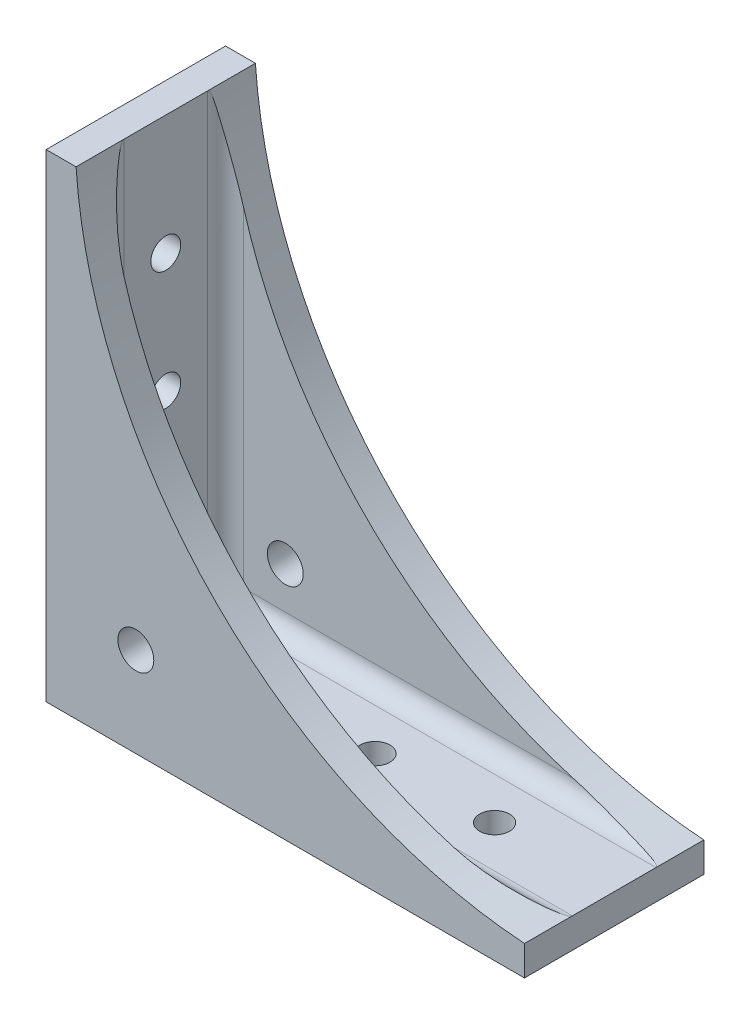
ISO-10303-21;
HEADER;
FILE_DESCRIPTION(('STEP AP214'),'2;1');
FILE_NAME('part.step','',(''),(''),'','','');
FILE_SCHEMA(('AUTOMOTIVE_DESIGN { 1 0 10303 214 1 1 1 1 }'));
ENDSEC;
DATA;
#1=APPLICATION_CONTEXT('core data for automotive mechanical design processes');
#2=APPLICATION_PROTOCOL_DEFINITION('international standard','automotive_design',2000,#1);
#3=PRODUCT_CONTEXT('',#1,'mechanical');
#4=PRODUCT('Part','Part','',(#3));
#5=PRODUCT_RELATED_PRODUCT_CATEGORY('part','',(#4));
#6=PRODUCT_DEFINITION_FORMATION('','',#4);
#7=PRODUCT_DEFINITION_CONTEXT('part definition',#1,'design');
#8=PRODUCT_DEFINITION('design','',#6,#7);
#9=PRODUCT_DEFINITION_SHAPE('','',#8);
#10=(LENGTH_UNIT() NAMED_UNIT(*) SI_UNIT(.MILLI.,.METRE.));
#11=(NAMED_UNIT(*) PLANE_ANGLE_UNIT() SI_UNIT($,.RADIAN.));
#12=(NAMED_UNIT(*) SI_UNIT($,.STERADIAN.) SOLID_ANGLE_UNIT());
#13=UNCERTAINTY_MEASURE_WITH_UNIT(LENGTH_MEASURE(1.E-05),#10,'distance_accuracy_value','');
#14=(GEOMETRIC_REPRESENTATION_CONTEXT(3) GLOBAL_UNCERTAINTY_ASSIGNED_CONTEXT((#13)) GLOBAL_UNIT_ASSIGNED_CONTEXT((#10,
#11,#12)) REPRESENTATION_CONTEXT('',''));
#15=CARTESIAN_POINT('',(0.,0.,0.));
#16=DIRECTION('',(0.,0.,1.));
#17=DIRECTION('',(1.,0.,0.));
#18=AXIS2_PLACEMENT_3D('',#15,#16,#17);
#19=CARTESIAN_POINT('',(5.00000000000001,5.,30.));
#20=DIRECTION('',(0.,-1.,0.));
#21=DIRECTION('',(0.,0.,-1.));
#22=AXIS2_PLACEMENT_3D('',#19,#20,#21);
#23=PLANE('',#22);
#24=CARTESIAN_POINT('',(60.,5.,15.));
#25=DIRECTION('',(0.,1.,0.));
#26=DIRECTION('',(0.,0.,1.));
#27=AXIS2_PLACEMENT_3D('',#24,#25,#26);
#28=CIRCLE('',#27,2.5);
#29=CARTESIAN_POINT('',(60.,5.,17.5));
#30=VERTEX_POINT('',#29);
#31=EDGE_CURVE('E347',#30,#30,#28,.T.);
#32=ORIENTED_EDGE('',*,*,#31,.F.);
#33=EDGE_LOOP('',(#32));
#34=FACE_BOUND('',#33,.T.);
#35=CARTESIAN_POINT('',(40.,5.,15.));
#36=DIRECTION('',(0.,1.,0.));
#37=DIRECTION('',(0.,0.,1.));
#38=AXIS2_PLACEMENT_3D('',#35,#36,#37);
#39=CIRCLE('',#38,2.5);
#40=CARTESIAN_POINT('',(40.,5.,17.5));
#41=VERTEX_POINT('',#40);
#42=EDGE_CURVE('E288',#41,#41,#39,.T.);
#43=ORIENTED_EDGE('',*,*,#42,.F.);
#44=EDGE_LOOP('',(#43));
#45=FACE_BOUND('',#44,.T.);
#46=DIRECTION('',(0.,0.,-1.));
#47=VECTOR('',#46,1.);
#48=CARTESIAN_POINT('',(80.,5.,30.));
#49=LINE('',#48,#47);
#50=CARTESIAN_POINT('',(80.,5.,22.));
#51=VERTEX_POINT('',#50);
#52=CARTESIAN_POINT('',(80.,5.,8.));
#53=VERTEX_POINT('',#52);
#54=EDGE_CURVE('E282',#51,#53,#49,.T.);
#55=ORIENTED_EDGE('',*,*,#54,.T.);
#56=DIRECTION('',(-1.,0.,0.));
#57=VECTOR('',#56,1.);
#58=CARTESIAN_POINT('',(5.00000000000001,5.,8.));
#59=LINE('',#58,#57);
#60=CARTESIAN_POINT('',(8.00000000000001,5.,8.));
#61=VERTEX_POINT('',#60);
#62=EDGE_CURVE('E151',#53,#61,#59,.T.);
#63=ORIENTED_EDGE('',*,*,#62,.T.);
#64=DIRECTION('',(0.,0.,-1.));
#65=VECTOR('',#64,1.);
#66=CARTESIAN_POINT('',(8.00000000000001,5.,22.));
#67=LINE('',#66,#65);
#68=CARTESIAN_POINT('',(8.00000000000001,5.,22.));
#69=VERTEX_POINT('',#68);
#70=EDGE_CURVE('E140',#61,#69,#67,.F.);
#71=ORIENTED_EDGE('',*,*,#70,.T.);
#72=DIRECTION('',(1.,0.,0.));
#73=VECTOR('',#72,1.);
#74=CARTESIAN_POINT('',(80.,5.,22.));
#75=LINE('',#74,#73);
#76=EDGE_CURVE('E297',#69,#51,#75,.T.);
#77=ORIENTED_EDGE('',*,*,#76,.T.);
#78=EDGE_LOOP('',(#55,#63,#71,#77));
#79=FACE_BOUND('',#78,.T.);
#80=ADVANCED_FACE('F34',(#34,#45,#79),#23,.F.);
#81=CARTESIAN_POINT('',(5.,80.,30.));
#82=DIRECTION('',(-1.,0.,0.));
#83=DIRECTION('',(0.,-1.,0.));
#84=AXIS2_PLACEMENT_3D('',#81,#82,#83);
#85=PLANE('',#84);
#86=CARTESIAN_POINT('',(5.,60.,15.));
#87=DIRECTION('',(1.,0.,0.));
#88=DIRECTION('',(0.,1.,0.));
#89=AXIS2_PLACEMENT_3D('',#86,#87,#88);
#90=CIRCLE('',#89,2.5);
#91=CARTESIAN_POINT('',(5.,62.5,15.));
#92=VERTEX_POINT('',#91);
#93=EDGE_CURVE('E289',#92,#92,#90,.T.);
#94=ORIENTED_EDGE('',*,*,#93,.F.);
#95=EDGE_LOOP('',(#94));
#96=FACE_BOUND('',#95,.T.);
#97=CARTESIAN_POINT('',(5.00000000000001,40.,15.));
#98=DIRECTION('',(1.,0.,0.));
#99=DIRECTION('',(0.,1.,0.));
#100=AXIS2_PLACEMENT_3D('',#97,#98,#99);
#101=CIRCLE('',#100,2.5);
#102=CARTESIAN_POINT('',(5.00000000000001,42.5,15.));
#103=VERTEX_POINT('',#102);
#104=EDGE_CURVE('E293',#103,#103,#101,.T.);
#105=ORIENTED_EDGE('',*,*,#104,.F.);
#106=EDGE_LOOP('',(#105));
#107=FACE_BOUND('',#106,.T.);
#108=DIRECTION('',(0.,-1.,0.));
#109=VECTOR('',#108,1.);
#110=CARTESIAN_POINT('',(5.00000000000001,5.,22.));
#111=LINE('',#110,#109);
#112=CARTESIAN_POINT('',(5.,80.,22.));
#113=VERTEX_POINT('',#112);
#114=CARTESIAN_POINT('',(5.00000000000001,8.00000000000001,22.));
#115=VERTEX_POINT('',#114);
#116=EDGE_CURVE('E117',#113,#115,#111,.T.);
#117=ORIENTED_EDGE('',*,*,#116,.T.);
#118=DIRECTION('',(0.,0.,-1.));
#119=VECTOR('',#118,1.);
#120=CARTESIAN_POINT('',(5.00000000000001,8.00000000000001,8.));
#121=LINE('',#120,#119);
#122=CARTESIAN_POINT('',(5.00000000000001,8.00000000000001,8.));
#123=VERTEX_POINT('',#122);
#124=EDGE_CURVE('E109',#115,#123,#121,.T.);
#125=ORIENTED_EDGE('',*,*,#124,.T.);
#126=DIRECTION('',(0.,1.,0.));
#127=VECTOR('',#126,1.);
#128=CARTESIAN_POINT('',(5.,80.,8.));
#129=LINE('',#128,#127);
#130=CARTESIAN_POINT('',(5.,80.,8.));
#131=VERTEX_POINT('',#130);
#132=EDGE_CURVE('E114',#123,#131,#129,.T.);
#133=ORIENTED_EDGE('',*,*,#132,.T.);
#134=DIRECTION('',(0.,0.,-1.));
#135=VECTOR('',#134,1.);
#136=CARTESIAN_POINT('',(5.,80.,30.));
#137=LINE('',#136,#135);
#138=EDGE_CURVE('E278',#113,#131,#137,.T.);
#139=ORIENTED_EDGE('',*,*,#138,.F.);
#140=EDGE_LOOP('',(#117,#125,#133,#139));
#141=FACE_BOUND('',#140,.T.);
#142=ADVANCED_FACE('F111',(#96,#107,#141),#85,.F.);
#143=CARTESIAN_POINT('',(80.,0.,30.));
#144=DIRECTION('',(0.,1.,0.));
#145=DIRECTION('',(-1.,0.,0.));
#146=AXIS2_PLACEMENT_3D('',#143,#144,#145);
#147=PLANE('',#146);
#148=CARTESIAN_POINT('',(40.,0.,15.));
#149=DIRECTION('',(0.,1.,0.));
#150=DIRECTION('',(-1.,0.,0.));
#151=AXIS2_PLACEMENT_3D('',#148,#149,#150);
#152=CIRCLE('',#151,2.5);
#153=CARTESIAN_POINT('',(37.5,0.,15.));
#154=VERTEX_POINT('',#153);
#155=EDGE_CURVE('E344',#154,#154,#152,.T.);
#156=ORIENTED_EDGE('',*,*,#155,.T.);
#157=EDGE_LOOP('',(#156));
#158=FACE_BOUND('',#157,.T.);
#159=CARTESIAN_POINT('',(60.,0.,15.));
#160=DIRECTION('',(0.,1.,0.));
#161=DIRECTION('',(-1.,0.,0.));
#162=AXIS2_PLACEMENT_3D('',#159,#160,#161);
#163=CIRCLE('',#162,2.5);
#164=CARTESIAN_POINT('',(57.5,0.,15.));
#165=VERTEX_POINT('',#164);
#166=EDGE_CURVE('E266',#165,#165,#163,.T.);
#167=ORIENTED_EDGE('',*,*,#166,.T.);
#168=EDGE_LOOP('',(#167));
#169=FACE_BOUND('',#168,.T.);
#170=DIRECTION('',(1.,0.,0.));
#171=VECTOR('',#170,1.);
#172=CARTESIAN_POINT('',(80.,0.,0.));
#173=LINE('',#172,#171);
#174=CARTESIAN_POINT('',(0.,0.,0.));
#175=VERTEX_POINT('',#174);
#176=CARTESIAN_POINT('',(80.,0.,0.));
#177=VERTEX_POINT('',#176);
#178=EDGE_CURVE('E262',#175,#177,#173,.T.);
#179=ORIENTED_EDGE('',*,*,#178,.T.);
#180=DIRECTION('',(0.,0.,-1.));
#181=VECTOR('',#180,1.);
#182=CARTESIAN_POINT('',(80.,0.,30.));
#183=LINE('',#182,#181);
#184=CARTESIAN_POINT('',(80.,0.,30.));
#185=VERTEX_POINT('',#184);
#186=EDGE_CURVE('E253',#185,#177,#183,.T.);
#187=ORIENTED_EDGE('',*,*,#186,.F.);
#188=DIRECTION('',(1.,0.,0.));
#189=VECTOR('',#188,1.);
#190=CARTESIAN_POINT('',(80.,0.,30.));
#191=LINE('',#190,#189);
#192=CARTESIAN_POINT('',(0.,0.,30.));
#193=VERTEX_POINT('',#192);
#194=EDGE_CURVE('E271',#193,#185,#191,.T.);
#195=ORIENTED_EDGE('',*,*,#194,.F.);
#196=DIRECTION('',(0.,0.,-1.));
#197=VECTOR('',#196,1.);
#198=CARTESIAN_POINT('',(0.,0.,30.));
#199=LINE('',#198,#197);
#200=EDGE_CURVE('E272',#193,#175,#199,.T.);
#201=ORIENTED_EDGE('',*,*,#200,.T.);
#202=EDGE_LOOP('',(#179,#187,#195,#201));
#203=FACE_BOUND('',#202,.T.);
#204=ADVANCED_FACE('F211',(#158,#169,#203),#147,.F.);
#205=CARTESIAN_POINT('',(80.,5.,30.));
#206=DIRECTION('',(-1.,0.,0.));
#207=DIRECTION('',(0.,0.,1.));
#208=AXIS2_PLACEMENT_3D('',#205,#206,#207);
#209=PLANE('',#208);
#210=DIRECTION('',(0.,1.,0.));
#211=VECTOR('',#210,1.);
#212=CARTESIAN_POINT('',(80.,5.,0.));
#213=LINE('',#212,#211);
#214=CARTESIAN_POINT('',(80.,5.,0.));
#215=VERTEX_POINT('',#214);
#216=EDGE_CURVE('E246',#177,#215,#213,.T.);
#217=ORIENTED_EDGE('',*,*,#216,.T.);
#218=DIRECTION('',(0.,0.,-1.));
#219=VECTOR('',#218,1.);
#220=CARTESIAN_POINT('',(80.,5.,5.));
#221=LINE('',#220,#219);
#222=EDGE_CURVE('E162',#53,#215,#221,.T.);
#223=ORIENTED_EDGE('',*,*,#222,.F.);
#224=ORIENTED_EDGE('',*,*,#54,.F.);
#225=CARTESIAN_POINT('',(80.,5.,30.));
#226=VERTEX_POINT('',#225);
#227=EDGE_CURVE('E72',#226,#51,#49,.T.);
#228=ORIENTED_EDGE('',*,*,#227,.F.);
#229=DIRECTION('',(0.,1.,0.));
#230=VECTOR('',#229,1.);
#231=CARTESIAN_POINT('',(80.,5.,30.));
#232=LINE('',#231,#230);
#233=EDGE_CURVE('E321',#185,#226,#232,.T.);
#234=ORIENTED_EDGE('',*,*,#233,.F.);
#235=ORIENTED_EDGE('',*,*,#186,.T.);
#236=EDGE_LOOP('',(#217,#223,#224,#228,#234,#235));
#237=FACE_BOUND('',#236,.T.);
#238=ADVANCED_FACE('F231',(#237),#209,.F.);
#239=CARTESIAN_POINT('',(0.,80.,30.));
#240=DIRECTION('',(0.,-1.,0.));
#241=DIRECTION('',(0.,0.,-1.));
#242=AXIS2_PLACEMENT_3D('',#239,#240,#241);
#243=PLANE('',#242);
#244=DIRECTION('',(-1.,0.,0.));
#245=VECTOR('',#244,1.);
#246=CARTESIAN_POINT('',(0.,80.,0.));
#247=LINE('',#246,#245);
#248=CARTESIAN_POINT('',(5.,80.,0.));
#249=VERTEX_POINT('',#248);
#250=CARTESIAN_POINT('',(0.,80.,0.));
#251=VERTEX_POINT('',#250);
#252=EDGE_CURVE('E261',#249,#251,#247,.T.);
#253=ORIENTED_EDGE('',*,*,#252,.T.);
#254=DIRECTION('',(0.,0.,-1.));
#255=VECTOR('',#254,1.);
#256=CARTESIAN_POINT('',(0.,80.,30.));
#257=LINE('',#256,#255);
#258=CARTESIAN_POINT('',(0.,80.,30.));
#259=VERTEX_POINT('',#258);
#260=EDGE_CURVE('E275',#259,#251,#257,.T.);
#261=ORIENTED_EDGE('',*,*,#260,.F.);
#262=DIRECTION('',(-1.,0.,0.));
#263=VECTOR('',#262,1.);
#264=CARTESIAN_POINT('',(0.,80.,30.));
#265=LINE('',#264,#263);
#266=CARTESIAN_POINT('',(5.,80.,30.));
#267=VERTEX_POINT('',#266);
#268=EDGE_CURVE('E324',#267,#259,#265,.T.);
#269=ORIENTED_EDGE('',*,*,#268,.F.);
#270=EDGE_CURVE('E279',#267,#113,#137,.T.);
#271=ORIENTED_EDGE('',*,*,#270,.T.);
#272=ORIENTED_EDGE('',*,*,#138,.T.);
#273=DIRECTION('',(0.,0.,-1.));
#274=VECTOR('',#273,1.);
#275=CARTESIAN_POINT('',(5.,80.,5.));
#276=LINE('',#275,#274);
#277=EDGE_CURVE('E204',#131,#249,#276,.T.);
#278=ORIENTED_EDGE('',*,*,#277,.T.);
#279=EDGE_LOOP('',(#253,#261,#269,#271,#272,#278));
#280=FACE_BOUND('',#279,.T.);
#281=ADVANCED_FACE('F233',(#280),#243,.F.);
#282=CARTESIAN_POINT('',(0.,0.,30.));
#283=DIRECTION('',(1.,0.,0.));
#284=DIRECTION('',(0.,0.,-1.));
#285=AXIS2_PLACEMENT_3D('',#282,#283,#284);
#286=PLANE('',#285);
#287=CARTESIAN_POINT('',(0.,40.,15.));
#288=DIRECTION('',(1.,0.,0.));
#289=DIRECTION('',(0.,0.,-1.));
#290=AXIS2_PLACEMENT_3D('',#287,#288,#289);
#291=CIRCLE('',#290,2.5);
#292=CARTESIAN_POINT('',(0.,40.,12.5));
#293=VERTEX_POINT('',#292);
#294=EDGE_CURVE('E290',#293,#293,#291,.T.);
#295=ORIENTED_EDGE('',*,*,#294,.T.);
#296=EDGE_LOOP('',(#295));
#297=FACE_BOUND('',#296,.T.);
#298=CARTESIAN_POINT('',(0.,60.,15.));
#299=DIRECTION('',(1.,0.,0.));
#300=DIRECTION('',(0.,0.,-1.));
#301=AXIS2_PLACEMENT_3D('',#298,#299,#300);
#302=CIRCLE('',#301,2.5);
#303=CARTESIAN_POINT('',(0.,60.,12.5));
#304=VERTEX_POINT('',#303);
#305=EDGE_CURVE('E285',#304,#304,#302,.T.);
#306=ORIENTED_EDGE('',*,*,#305,.T.);
#307=EDGE_LOOP('',(#306));
#308=FACE_BOUND('',#307,.T.);
#309=DIRECTION('',(0.,-1.,0.));
#310=VECTOR('',#309,1.);
#311=CARTESIAN_POINT('',(0.,0.,0.));
#312=LINE('',#311,#310);
#313=EDGE_CURVE('E264',#251,#175,#312,.T.);
#314=ORIENTED_EDGE('',*,*,#313,.T.);
#315=ORIENTED_EDGE('',*,*,#200,.F.);
#316=DIRECTION('',(0.,-1.,0.));
#317=VECTOR('',#316,1.);
#318=CARTESIAN_POINT('',(0.,0.,30.));
#319=LINE('',#318,#317);
#320=EDGE_CURVE('E84',#259,#193,#319,.T.);
#321=ORIENTED_EDGE('',*,*,#320,.F.);
#322=ORIENTED_EDGE('',*,*,#260,.T.);
#323=EDGE_LOOP('',(#314,#315,#321,#322));
#324=FACE_BOUND('',#323,.T.);
#325=ADVANCED_FACE('F239',(#297,#308,#324),#286,.F.);
#326=CARTESIAN_POINT('',(0.,0.,30.));
#327=DIRECTION('',(0.,0.,-1.));
#328=DIRECTION('',(-1.,0.,0.));
#329=AXIS2_PLACEMENT_3D('',#326,#327,#328);
#330=PLANE('',#329);
#331=CARTESIAN_POINT('',(15.,15.,30.));
#332=DIRECTION('',(0.,0.,1.));
#333=DIRECTION('',(1.,0.,0.));
#334=AXIS2_PLACEMENT_3D('',#331,#332,#333);
#335=CIRCLE('',#334,3.);
#336=CARTESIAN_POINT('',(18.,15.,30.));
#337=VERTEX_POINT('',#336);
#338=EDGE_CURVE('E361',#337,#337,#335,.T.);
#339=ORIENTED_EDGE('',*,*,#338,.F.);
#340=EDGE_LOOP('',(#339));
#341=FACE_BOUND('',#340,.T.);
#342=ORIENTED_EDGE('',*,*,#233,.T.);
#343=CARTESIAN_POINT('',(85.7216540695725,85.7216540695725,30.));
#344=DIRECTION('',(0.,0.,1.));
#345=DIRECTION('',(-1.,0.,0.));
#346=AXIS2_PLACEMENT_3D('',#343,#344,#345);
#347=CIRCLE('',#346,80.9241790877089);
#348=EDGE_CURVE('E352',#267,#226,#347,.T.);
#349=ORIENTED_EDGE('',*,*,#348,.F.);
#350=ORIENTED_EDGE('',*,*,#268,.T.);
#351=ORIENTED_EDGE('',*,*,#320,.T.);
#352=ORIENTED_EDGE('',*,*,#194,.T.);
#353=EDGE_LOOP('',(#342,#349,#350,#351,#352));
#354=FACE_BOUND('',#353,.T.);
#355=ADVANCED_FACE('F327',(#341,#354),#330,.F.);
#356=CARTESIAN_POINT('',(0.,0.,0.));
#357=DIRECTION('',(0.,0.,-1.));
#358=DIRECTION('',(-1.,0.,0.));
#359=AXIS2_PLACEMENT_3D('',#356,#357,#358);
#360=PLANE('',#359);
#361=CARTESIAN_POINT('',(15.,15.,0.));
#362=DIRECTION('',(0.,0.,1.));
#363=DIRECTION('',(1.,0.,0.));
#364=AXIS2_PLACEMENT_3D('',#361,#362,#363);
#365=CIRCLE('',#364,3.);
#366=CARTESIAN_POINT('',(18.,15.,0.));
#367=VERTEX_POINT('',#366);
#368=EDGE_CURVE('E364',#367,#367,#365,.T.);
#369=ORIENTED_EDGE('',*,*,#368,.T.);
#370=EDGE_LOOP('',(#369));
#371=FACE_BOUND('',#370,.T.);
#372=CARTESIAN_POINT('',(85.7216540695725,85.7216540695725,0.));
#373=DIRECTION('',(0.,0.,1.));
#374=DIRECTION('',(-1.,0.,0.));
#375=AXIS2_PLACEMENT_3D('',#372,#373,#374);
#376=CIRCLE('',#375,80.9241790877089);
#377=EDGE_CURVE('E354',#249,#215,#376,.T.);
#378=ORIENTED_EDGE('',*,*,#377,.T.);
#379=ORIENTED_EDGE('',*,*,#216,.F.);
#380=ORIENTED_EDGE('',*,*,#178,.F.);
#381=ORIENTED_EDGE('',*,*,#313,.F.);
#382=ORIENTED_EDGE('',*,*,#252,.F.);
#383=EDGE_LOOP('',(#378,#379,#380,#381,#382));
#384=FACE_BOUND('',#383,.T.);
#385=ADVANCED_FACE('F331',(#371,#384),#360,.T.);
#386=CARTESIAN_POINT('',(60.,-0.999999999999996,15.));
#387=DIRECTION('',(0.,1.,0.));
#388=DIRECTION('',(0.,0.,1.));
#389=AXIS2_PLACEMENT_3D('',#386,#387,#388);
#390=CYLINDRICAL_SURFACE('',#389,2.5);
#391=ORIENTED_EDGE('',*,*,#31,.T.);
#392=EDGE_LOOP('',(#391));
#393=FACE_BOUND('',#392,.T.);
#394=ORIENTED_EDGE('',*,*,#166,.F.);
#395=EDGE_LOOP('',(#394));
#396=FACE_BOUND('',#395,.T.);
#397=ADVANCED_FACE('F386',(#393,#396),#390,.F.);
#398=CARTESIAN_POINT('',(40.,-0.999999999999996,15.));
#399=DIRECTION('',(0.,1.,0.));
#400=DIRECTION('',(0.,0.,1.));
#401=AXIS2_PLACEMENT_3D('',#398,#399,#400);
#402=CYLINDRICAL_SURFACE('',#401,2.5);
#403=ORIENTED_EDGE('',*,*,#42,.T.);
#404=EDGE_LOOP('',(#403));
#405=FACE_BOUND('',#404,.T.);
#406=ORIENTED_EDGE('',*,*,#155,.F.);
#407=EDGE_LOOP('',(#406));
#408=FACE_BOUND('',#407,.T.);
#409=ADVANCED_FACE('F393',(#405,#408),#402,.F.);
#410=CARTESIAN_POINT('',(-0.999999999999997,60.,15.));
#411=DIRECTION('',(1.,0.,0.));
#412=DIRECTION('',(0.,1.,0.));
#413=AXIS2_PLACEMENT_3D('',#410,#411,#412);
#414=CYLINDRICAL_SURFACE('',#413,2.5);
#415=ORIENTED_EDGE('',*,*,#93,.T.);
#416=EDGE_LOOP('',(#415));
#417=FACE_BOUND('',#416,.T.);
#418=ORIENTED_EDGE('',*,*,#305,.F.);
#419=EDGE_LOOP('',(#418));
#420=FACE_BOUND('',#419,.T.);
#421=ADVANCED_FACE('F397',(#417,#420),#414,.F.);
#422=CARTESIAN_POINT('',(-0.999999999999994,40.,15.));
#423=DIRECTION('',(1.,0.,0.));
#424=DIRECTION('',(0.,1.,0.));
#425=AXIS2_PLACEMENT_3D('',#422,#423,#424);
#426=CYLINDRICAL_SURFACE('',#425,2.5);
#427=ORIENTED_EDGE('',*,*,#104,.T.);
#428=EDGE_LOOP('',(#427));
#429=FACE_BOUND('',#428,.T.);
#430=ORIENTED_EDGE('',*,*,#294,.F.);
#431=EDGE_LOOP('',(#430));
#432=FACE_BOUND('',#431,.T.);
#433=ADVANCED_FACE('F401',(#429,#432),#426,.F.);
#434=CARTESIAN_POINT('',(0.,0.,5.));
#435=DIRECTION('',(0.,0.,1.));
#436=DIRECTION('',(1.,0.,0.));
#437=AXIS2_PLACEMENT_3D('',#434,#435,#436);
#438=PLANE('',#437);
#439=CARTESIAN_POINT('',(15.,15.,5.));
#440=DIRECTION('',(0.,0.,1.));
#441=DIRECTION('',(1.,0.,0.));
#442=AXIS2_PLACEMENT_3D('',#439,#440,#441);
#443=CIRCLE('',#442,3.);
#444=CARTESIAN_POINT('',(18.,15.,5.));
#445=VERTEX_POINT('',#444);
#446=EDGE_CURVE('E355',#445,#445,#443,.T.);
#447=ORIENTED_EDGE('',*,*,#446,.F.);
#448=EDGE_LOOP('',(#447));
#449=FACE_BOUND('',#448,.T.);
#450=CARTESIAN_POINT('',(85.7216540695725,85.7216540695725,5.));
#451=DIRECTION('',(0.,0.,1.));
#452=DIRECTION('',(1.,0.,0.));
#453=AXIS2_PLACEMENT_3D('',#450,#451,#452);
#454=CIRCLE('',#453,80.9241790877089);
#455=CARTESIAN_POINT('',(8.,63.1813069180912,5.));
#456=VERTEX_POINT('',#455);
#457=CARTESIAN_POINT('',(63.1813069180912,8.,5.));
#458=VERTEX_POINT('',#457);
#459=EDGE_CURVE('E51',#456,#458,#454,.T.);
#460=ORIENTED_EDGE('',*,*,#459,.F.);
#461=DIRECTION('',(0.,1.,0.));
#462=VECTOR('',#461,1.);
#463=CARTESIAN_POINT('',(8.00000000000001,0.,5.));
#464=LINE('',#463,#462);
#465=CARTESIAN_POINT('',(8.00000000000001,8.00000000000001,5.));
#466=VERTEX_POINT('',#465);
#467=EDGE_CURVE('E133',#456,#466,#464,.F.);
#468=ORIENTED_EDGE('',*,*,#467,.T.);
#469=DIRECTION('',(-1.,0.,0.));
#470=VECTOR('',#469,1.);
#471=CARTESIAN_POINT('',(0.,8.,5.));
#472=LINE('',#471,#470);
#473=EDGE_CURVE('E148',#466,#458,#472,.F.);
#474=ORIENTED_EDGE('',*,*,#473,.T.);
#475=EDGE_LOOP('',(#460,#468,#474));
#476=FACE_BOUND('',#475,.T.);
#477=ADVANCED_FACE('F404',(#449,#476),#438,.T.);
#478=CARTESIAN_POINT('',(0.,0.,25.));
#479=DIRECTION('',(0.,0.,1.));
#480=DIRECTION('',(1.,0.,0.));
#481=AXIS2_PLACEMENT_3D('',#478,#479,#480);
#482=PLANE('',#481);
#483=CARTESIAN_POINT('',(15.,15.,25.));
#484=DIRECTION('',(0.,0.,1.));
#485=DIRECTION('',(1.,0.,0.));
#486=AXIS2_PLACEMENT_3D('',#483,#484,#485);
#487=CIRCLE('',#486,3.);
#488=CARTESIAN_POINT('',(18.,15.,25.));
#489=VERTEX_POINT('',#488);
#490=EDGE_CURVE('E39',#489,#489,#487,.T.);
#491=ORIENTED_EDGE('',*,*,#490,.T.);
#492=EDGE_LOOP('',(#491));
#493=FACE_BOUND('',#492,.T.);
#494=DIRECTION('',(0.,-1.,0.));
#495=VECTOR('',#494,1.);
#496=CARTESIAN_POINT('',(8.,80.,25.));
#497=LINE('',#496,#495);
#498=CARTESIAN_POINT('',(8.00000000000001,8.00000000000001,25.));
#499=VERTEX_POINT('',#498);
#500=CARTESIAN_POINT('',(8.00000000000001,63.1813069180912,25.));
#501=VERTEX_POINT('',#500);
#502=EDGE_CURVE('E134',#499,#501,#497,.F.);
#503=ORIENTED_EDGE('',*,*,#502,.T.);
#504=CARTESIAN_POINT('',(85.7216540695725,85.7216540695725,25.));
#505=DIRECTION('',(0.,0.,1.));
#506=DIRECTION('',(1.,0.,0.));
#507=AXIS2_PLACEMENT_3D('',#504,#505,#506);
#508=CIRCLE('',#507,80.9241790877089);
#509=CARTESIAN_POINT('',(63.1813069180912,8.00000000000001,25.));
#510=VERTEX_POINT('',#509);
#511=EDGE_CURVE('E197',#501,#510,#508,.T.);
#512=ORIENTED_EDGE('',*,*,#511,.T.);
#513=DIRECTION('',(1.,0.,0.));
#514=VECTOR('',#513,1.);
#515=CARTESIAN_POINT('',(8.00000000000001,8.,25.));
#516=LINE('',#515,#514);
#517=EDGE_CURVE('E44',#510,#499,#516,.F.);
#518=ORIENTED_EDGE('',*,*,#517,.T.);
#519=EDGE_LOOP('',(#503,#512,#518));
#520=FACE_BOUND('',#519,.T.);
#521=ADVANCED_FACE('F180',(#493,#520),#482,.F.);
#522=CARTESIAN_POINT('',(8.,80.,22.));
#523=DIRECTION('',(0.,1.,0.));
#524=DIRECTION('',(-1.,0.,0.));
#525=AXIS2_PLACEMENT_3D('',#522,#523,#524);
#526=CYLINDRICAL_SURFACE('',#525,3.);
#527=ORIENTED_EDGE('',*,*,#116,.F.);
#528=CARTESIAN_POINT('',(5.,80.,22.));
#529=CARTESIAN_POINT('',(4.99999719192572,80.0000408328603,22.0132268724489));
#530=CARTESIAN_POINT('',(5.00008735173605,79.9987675626277,22.0263960706427));
#531=CARTESIAN_POINT('',(5.00042663136717,79.9939834246143,22.0521386010187));
#532=CARTESIAN_POINT('',(5.00067352412817,79.9905039067975,22.064717671454));
#533=CARTESIAN_POINT('',(5.00140522668533,79.9802065043733,22.0932656700427));
#534=CARTESIAN_POINT('',(5.00194193607724,79.9726620765032,22.1089650703714));
#535=CARTESIAN_POINT('',(5.00318659521502,79.9552125486081,22.1390592955091));
#536=CARTESIAN_POINT('',(5.00389563096059,79.9452924833886,22.1534450175517));
#537=CARTESIAN_POINT('',(5.00611138375251,79.9143886297326,22.1931656637642));
#538=CARTESIAN_POINT('',(5.00776796293319,79.891393758899,22.2168995529167));
#539=CARTESIAN_POINT('',(5.01130774145571,79.842592154117,22.2611637704138));
#540=CARTESIAN_POINT('',(5.01319151254815,79.8167783421215,22.281685704603));
#541=CARTESIAN_POINT('',(5.01878951252028,79.7406124682485,22.3372221757));
#542=CARTESIAN_POINT('',(5.02268184460047,79.6882896078917,22.3694802439697));
#543=CARTESIAN_POINT('',(5.03076326092421,79.5811467442933,22.42957217354));
#544=CARTESIAN_POINT('',(5.03495315824114,79.5263200576348,22.4573931815362));
#545=CARTESIAN_POINT('',(5.04357981709191,79.4149730260712,22.5101957301364));
#546=CARTESIAN_POINT('',(5.04801778873432,79.358445138424,22.5351611385143));
#547=CARTESIAN_POINT('',(5.05707776703675,79.2446058200486,22.5829182900738));
#548=CARTESIAN_POINT('',(5.06169949958147,79.1872956343688,22.6057131105215));
#549=CARTESIAN_POINT('',(5.0756979848861,79.0160209271449,22.6711533381355));
#550=CARTESIAN_POINT('',(5.0853241898871,78.9012103644403,22.7115232850345));
#551=CARTESIAN_POINT('',(5.10518355793157,78.6703491446484,22.7884099653245));
#552=CARTESIAN_POINT('',(5.11541692411889,78.5542980832842,22.8249253975868));
#553=CARTESIAN_POINT('',(5.14701192538435,78.2047030613997,22.9305477631102));
#554=CARTESIAN_POINT('',(5.16924346366086,77.9700240093802,22.9956225626019));
#555=CARTESIAN_POINT('',(5.21586838372961,77.4999171931956,23.119331672844));
#556=CARTESIAN_POINT('',(5.24025580876046,77.2644931240808,23.1779827856437));
#557=CARTESIAN_POINT('',(5.29119920535146,76.7929998776957,23.2908257800649));
#558=CARTESIAN_POINT('',(5.31775356019174,76.5569313061114,23.3450209267044));
#559=CARTESIAN_POINT('',(5.37313375789986,76.0834450121713,23.450211179239));
#560=CARTESIAN_POINT('',(5.40196747356137,75.8460254990783,23.5011939942713));
#561=CARTESIAN_POINT('',(5.46181813428893,75.3708645760504,23.6003059209978));
#562=CARTESIAN_POINT('',(5.49283511776911,75.1331231605239,23.6484349824533));
#563=CARTESIAN_POINT('',(5.58916514029803,74.4195576518401,23.7890842534692));
#564=CARTESIAN_POINT('',(5.65775280115873,73.9434303843967,23.8778582283845));
#565=CARTESIAN_POINT('',(5.80372778678027,72.9905754864598,24.0466597675961));
#566=CARTESIAN_POINT('',(5.8811222586328,72.513847683352,24.1266801231882));
#567=CARTESIAN_POINT('',(6.04468591050083,71.5605319528839,24.2779720689022));
#568=CARTESIAN_POINT('',(6.13085462281536,71.0839440194247,24.3492441248963));
#569=CARTESIAN_POINT('',(6.3119370425265,70.1314497816796,24.4825535606658));
#570=CARTESIAN_POINT('',(6.40684523652514,69.6555432374069,24.5445966988563));
#571=CARTESIAN_POINT('',(6.60547531020674,68.7043368059198,24.6586495463092));
#572=CARTESIAN_POINT('',(6.70919758216781,68.2290369466631,24.7106588086681));
#573=CARTESIAN_POINT('',(6.92538002657037,67.279669308306,24.8033938680677));
#574=CARTESIAN_POINT('',(7.03783402942336,66.8056008995039,24.8441275408693));
#575=CARTESIAN_POINT('',(7.27151291738868,65.8587273137492,24.9127546235652));
#576=CARTESIAN_POINT('',(7.39273683197221,65.3859220030015,24.9406494517721));
#577=CARTESIAN_POINT('',(7.59535253617943,64.6244138618397,24.9736092388808));
#578=CARTESIAN_POINT('',(7.67403000151087,64.3351866334909,24.9833309674554));
#579=CARTESIAN_POINT('',(7.83460340476105,63.7575937116134,24.9965150916806));
#580=CARTESIAN_POINT('',(7.91649822340985,63.4692277553751,24.9999796447505));
#581=CARTESIAN_POINT('',(8.00000000000002,63.1813069180912,25.));
#582=B_SPLINE_CURVE_WITH_KNOTS('',3,(#528,#529,#530,#531,#532,#533,#534,#535,#536,#537,#538,
#539,#540,#541,#542,#543,#544,#545,#546,#547,#548,#549,#550,#551,#552,#553,#554,#555,#556,#557,
#558,#559,#560,#561,#562,#563,#564,#565,#566,#567,#568,#569,#570,#571,#572,#573,#574,#575,#576,
#577,#578,#579,#580,#581),.UNSPECIFIED.,.F.,.F.,(4,2,2,2,2,2,2,2,2,2,2,2,2,2,2,2,2,2,2,2,2,2,2,
2,2,2,4),(0.,0.0395263448667529,0.0785032500716997,0.130486532666296,0.182806318511064,
0.281514850570174,0.380477189527827,0.564746922444159,0.749541116215597,0.93533248304103,
1.12085640253971,1.48696746469636,1.85320171862827,2.58664779336856,3.31812715709193,
4.04906567703577,4.78264948638549,5.51624620620813,6.98355732315977,8.45206783250782,
9.92050010549974,11.3880122668188,12.8555897752672,14.3221396103379,15.7885273961155,
16.6881361756471,17.5874347187083),.UNSPECIFIED.);
#583=EDGE_CURVE('E157',#113,#501,#582,.T.);
#584=ORIENTED_EDGE('',*,*,#583,.T.);
#585=ORIENTED_EDGE('',*,*,#502,.F.);
#586=CARTESIAN_POINT('',(8.00000000000001,8.00000000000001,22.));
#587=DIRECTION('',(0.,1.,0.));
#588=DIRECTION('',(-1.,0.,0.));
#589=AXIS2_PLACEMENT_3D('',#586,#587,#588);
#590=CIRCLE('',#589,3.);
#591=EDGE_CURVE('E122',#499,#115,#590,.F.);
#592=ORIENTED_EDGE('',*,*,#591,.T.);
#593=EDGE_LOOP('',(#527,#584,#585,#592));
#594=FACE_BOUND('',#593,.T.);
#595=ADVANCED_FACE('F206',(#594),#526,.F.);
#596=CARTESIAN_POINT('',(8.,80.,8.));
#597=DIRECTION('',(0.,1.,0.));
#598=DIRECTION('',(-1.,0.,0.));
#599=AXIS2_PLACEMENT_3D('',#596,#597,#598);
#600=CYLINDRICAL_SURFACE('',#599,3.);
#601=ORIENTED_EDGE('',*,*,#467,.F.);
#602=CARTESIAN_POINT('',(8.,63.1813069180912,5.));
#603=CARTESIAN_POINT('',(7.93007715674195,63.4224070528661,5.00001113310865));
#604=CARTESIAN_POINT('',(7.8612793307176,63.6638250526596,5.00244439797567));
#605=CARTESIAN_POINT('',(7.72595829397065,64.1471977019946,5.01177017154698));
#606=CARTESIAN_POINT('',(7.65943495015487,64.3891523192501,5.0186624188585));
#607=CARTESIAN_POINT('',(7.52869512956919,64.8734686076394,5.03651906121091));
#608=CARTESIAN_POINT('',(7.46447809664036,65.1158301656829,5.04748246717589));
#609=CARTESIAN_POINT('',(7.33834591801557,65.6009537254469,5.07316640704638));
#610=CARTESIAN_POINT('',(7.27643081134163,65.843715733883,5.08788700461015));
#611=CARTESIAN_POINT('',(7.09426715806258,66.5720557247591,5.13722437958062));
#612=CARTESIAN_POINT('',(6.97747369473402,67.0581566966834,5.17703516524494));
#613=CARTESIAN_POINT('',(6.75314479686832,68.0313542787579,5.26869552471523));
#614=CARTESIAN_POINT('',(6.64560979391329,68.5184509342395,5.32054565931807));
#615=CARTESIAN_POINT('',(6.41405744820477,69.6152661380519,5.44922334787077));
#616=CARTESIAN_POINT('',(6.292644483089,70.2251835631069,5.52905452037485));
#617=CARTESIAN_POINT('',(6.06424537921246,71.4456110119657,5.70358263141201));
#618=CARTESIAN_POINT('',(5.95725988139194,72.0561210608841,5.7982802299819));
#619=CARTESIAN_POINT('',(5.7897271906166,73.0809989049615,5.96922672864036));
#620=CARTESIAN_POINT('',(5.72530155428103,73.4953824368254,6.04163163075566));
#621=CARTESIAN_POINT('',(5.60306388565481,74.3238665991472,6.19328795373868));
#622=CARTESIAN_POINT('',(5.54525159954649,74.7379672398555,6.27253911164487));
#623=CARTESIAN_POINT('',(5.45402170220811,75.4304435749286,6.41177116650955));
#624=CARTESIAN_POINT('',(5.418799509915,75.7090160261731,6.46960187299738));
#625=CARTESIAN_POINT('',(5.35135762563274,76.2656098089595,6.58952349309649));
#626=CARTESIAN_POINT('',(5.31913786837186,76.5436311523537,6.65161431404364));
#627=CARTESIAN_POINT('',(5.26780413554508,77.0075300281789,6.76007207920969));
#628=CARTESIAN_POINT('',(5.24786183935126,77.1936746450329,6.80490388784214));
#629=CARTESIAN_POINT('',(5.20934722964428,77.5653010155481,6.89782192100069));
#630=CARTESIAN_POINT('',(5.190774924673,77.7507827650695,6.9459081658146));
#631=CARTESIAN_POINT('',(5.1608904681638,78.0599503141392,7.03007995990117));
#632=CARTESIAN_POINT('',(5.1491963523472,78.1839347125035,7.06492333462571));
#633=CARTESIAN_POINT('',(5.12645219909466,78.4311386328712,7.13735574372895));
#634=CARTESIAN_POINT('',(5.11540208795075,78.5543582409589,7.1749444627821));
#635=CARTESIAN_POINT('',(5.09023378918583,78.8423887767139,7.26762730283449));
#636=CARTESIAN_POINT('',(5.07638612468335,79.0067510859287,7.32426115747026));
#637=CARTESIAN_POINT('',(5.05429543554959,79.2786593264424,7.43013730938059));
#638=CARTESIAN_POINT('',(5.04568109269919,79.3874940092406,7.47590881053634));
#639=CARTESIAN_POINT('',(5.03183841339432,79.5668405927197,7.56259889523272));
#640=CARTESIAN_POINT('',(5.02639451724777,79.638680319967,7.6005484388864));
#641=CARTESIAN_POINT('',(5.01856472219476,79.7437386965812,7.66601303620681));
#642=CARTESIAN_POINT('',(5.01595134233244,79.7791385414359,7.68996109263305));
#643=CARTESIAN_POINT('',(5.01099845539112,79.846796618486,7.74199739674223));
#644=CARTESIAN_POINT('',(5.0086577979197,79.8790679427155,7.77006703421896));
#645=CARTESIAN_POINT('',(5.00574861959945,79.9194554013964,7.81395569499546));
#646=CARTESIAN_POINT('',(5.00495788729181,79.9304689874011,7.82705244493292));
#647=CARTESIAN_POINT('',(5.0034985171176,79.950845834606,7.85450550037675));
#648=CARTESIAN_POINT('',(5.00282982380988,79.960209845125,7.86886122953062));
#649=CARTESIAN_POINT('',(5.0017696139679,79.9750846192967,7.89623582781794));
#650=CARTESIAN_POINT('',(5.00134995607939,79.9809844489178,7.90903869735604));
#651=CARTESIAN_POINT('',(5.00066623341356,79.9906063940867,7.93542924182763));
#652=CARTESIAN_POINT('',(5.00040163957457,79.9943359141848,7.94901407245675));
#653=CARTESIAN_POINT('',(5.00015438024331,79.9978223134335,7.9689490807065));
#654=CARTESIAN_POINT('',(5.00009675649927,79.9986350743393,7.97512317380158));
#655=CARTESIAN_POINT('',(5.00001947570952,79.9997252281452,7.98753015969849));
#656=CARTESIAN_POINT('',(4.99999989012852,80.0000016133218,7.99376314111355));
#657=CARTESIAN_POINT('',(5.,80.,8.));
#658=B_SPLINE_CURVE_WITH_KNOTS('',3,(#602,#603,#604,#605,#606,#607,#608,#609,#610,#611,#612,
#613,#614,#615,#616,#617,#618,#619,#620,#621,#622,#623,#624,#625,#626,#627,#628,#629,#630,#631,
#632,#633,#634,#635,#636,#637,#638,#639,#640,#641,#642,#643,#644,#645,#646,#647,#648,#649,#650,
#651,#652,#653,#654,#655,#656,#657),.UNSPECIFIED.,.F.,.F.,(4,2,2,2,2,2,2,2,2,2,2,2,2,2,2,2,2,2,
2,2,2,2,2,2,2,2,2,4),(0.,0.753078274387303,1.50611240610651,2.2589637099864,3.01182777030793,
4.51609818719004,6.0204386875489,7.90102665479433,9.78169813965942,11.0583058545126,
12.3348645572354,13.1948793266535,14.0548753953362,14.6323603919586,15.2098489888918,
15.5977709587325,15.985648442379,16.5085073803314,16.8633864951707,17.1071315810909,
17.2354695317964,17.3632448684235,17.4145487091734,17.4658291847513,17.5079937892851,
17.5500136823802,17.5686759001407,17.5873731459946),.UNSPECIFIED.);
#659=EDGE_CURVE('E132',#456,#131,#658,.T.);
#660=ORIENTED_EDGE('',*,*,#659,.T.);
#661=ORIENTED_EDGE('',*,*,#132,.F.);
#662=CARTESIAN_POINT('',(8.00000000000001,8.00000000000001,8.));
#663=DIRECTION('',(0.,1.,0.));
#664=DIRECTION('',(-1.,0.,0.));
#665=AXIS2_PLACEMENT_3D('',#662,#663,#664);
#666=CIRCLE('',#665,3.);
#667=EDGE_CURVE('E123',#123,#466,#666,.F.);
#668=ORIENTED_EDGE('',*,*,#667,.T.);
#669=EDGE_LOOP('',(#601,#660,#661,#668));
#670=FACE_BOUND('',#669,.T.);
#671=ADVANCED_FACE('F129',(#670),#600,.F.);
#672=CARTESIAN_POINT('',(5.00000000000001,8.,22.));
#673=DIRECTION('',(-1.,0.,0.));
#674=DIRECTION('',(0.,0.,1.));
#675=AXIS2_PLACEMENT_3D('',#672,#673,#674);
#676=CYLINDRICAL_SURFACE('',#675,3.);
#677=ORIENTED_EDGE('',*,*,#517,.F.);
#678=CARTESIAN_POINT('',(63.1813069180912,8.00000000000001,25.));
#679=CARTESIAN_POINT('',(63.422407052866,7.93007715674195,24.9999888668913));
#680=CARTESIAN_POINT('',(63.6638250526596,7.86127933071761,24.9975556020243));
#681=CARTESIAN_POINT('',(64.1471977019946,7.72595829397066,24.988229828453));
#682=CARTESIAN_POINT('',(64.3891523192501,7.65943495015489,24.9813375811415));
#683=CARTESIAN_POINT('',(64.8734686076393,7.52869512956919,24.9634809387891));
#684=CARTESIAN_POINT('',(65.1158301656829,7.46447809664035,24.9525175328241));
#685=CARTESIAN_POINT('',(65.6009537254469,7.33834591801556,24.9268335929536));
#686=CARTESIAN_POINT('',(65.843715733883,7.27643081134163,24.9121129953899));
#687=CARTESIAN_POINT('',(66.5720557247591,7.09426715806259,24.8627756204194));
#688=CARTESIAN_POINT('',(67.0581566966834,6.97747369473401,24.8229648347551));
#689=CARTESIAN_POINT('',(68.0313542787579,6.75314479686831,24.7313044752848));
#690=CARTESIAN_POINT('',(68.5184509342395,6.64560979391329,24.6794543406819));
#691=CARTESIAN_POINT('',(69.6152661380524,6.41405744820465,24.5507766521292));
#692=CARTESIAN_POINT('',(70.225183563108,6.29264448308877,24.470945479625));
#693=CARTESIAN_POINT('',(71.4456110119679,6.06424537921205,24.2964173685876));
#694=CARTESIAN_POINT('',(72.0561210608868,5.95725988139146,24.2017197700177));
#695=CARTESIAN_POINT('',(73.080998904965,5.78972719061603,24.030773271359));
#696=CARTESIAN_POINT('',(73.4953824368292,5.72530155428045,23.9583683692437));
#697=CARTESIAN_POINT('',(74.3238665991513,5.60306388565422,23.8067120462605));
#698=CARTESIAN_POINT('',(74.7379672398598,5.54525159954589,23.7274608883543));
#699=CARTESIAN_POINT('',(75.4304435749328,5.45402170220756,23.5882288334896));
#700=CARTESIAN_POINT('',(75.709016026177,5.41879950991449,23.5303981270017));
#701=CARTESIAN_POINT('',(76.2656098089629,5.35135762563232,23.4104765069027));
#702=CARTESIAN_POINT('',(76.5436311523568,5.31913786837151,23.3483856859556));
#703=CARTESIAN_POINT('',(77.0075300281815,5.26780413554479,23.2399279207897));
#704=CARTESIAN_POINT('',(77.1936746450353,5.24786183935099,23.1950961121572));
#705=CARTESIAN_POINT('',(77.5653010155501,5.20934722964406,23.1021780789988));
#706=CARTESIAN_POINT('',(77.7507827650712,5.19077492467282,23.0540918341849));
#707=CARTESIAN_POINT('',(78.0599503141407,5.16089046816366,22.9699200400984));
#708=CARTESIAN_POINT('',(78.1839347125049,5.14919635234707,22.9350766653739));
#709=CARTESIAN_POINT('',(78.4311386328725,5.12645219909453,22.8626442562706));
#710=CARTESIAN_POINT('',(78.5543582409601,5.11540208795063,22.8250555372174));
#711=CARTESIAN_POINT('',(78.8423887767148,5.09023378918573,22.7323726971651));
#712=CARTESIAN_POINT('',(79.0067510859295,5.07638612468328,22.6757388425294));
#713=CARTESIAN_POINT('',(79.278659326443,5.05429543554954,22.5698626906191));
#714=CARTESIAN_POINT('',(79.3874940092411,5.04568109269915,22.5240911894634));
#715=CARTESIAN_POINT('',(79.56684059272,5.03183841339429,22.4374011047671));
#716=CARTESIAN_POINT('',(79.6386803199672,5.02639451724775,22.3994515611135));
#717=CARTESIAN_POINT('',(79.7437386965812,5.01856472219474,22.333986963793));
#718=CARTESIAN_POINT('',(79.7791385414358,5.01595134233242,22.3100389073668));
#719=CARTESIAN_POINT('',(79.8467966184859,5.0109984553911,22.2580026032576));
#720=CARTESIAN_POINT('',(79.8790679427153,5.00865779791969,22.2299329657808));
#721=CARTESIAN_POINT('',(79.9194554013962,5.00574861959944,22.1860443050044));
#722=CARTESIAN_POINT('',(79.930468987401,5.00495788729181,22.172947555067));
#723=CARTESIAN_POINT('',(79.9508458346059,5.0034985171176,22.1454944996231));
#724=CARTESIAN_POINT('',(79.9602098451248,5.00282982380988,22.1311387704693));
#725=CARTESIAN_POINT('',(79.9750846192966,5.00176961396791,22.103764172182));
#726=CARTESIAN_POINT('',(79.9809844489178,5.00134995607939,22.0909613026439));
#727=CARTESIAN_POINT('',(79.9906063940865,5.00066623341356,22.0645707581723));
#728=CARTESIAN_POINT('',(79.9943359141844,5.00040163957457,22.0509859275431));
#729=CARTESIAN_POINT('',(79.9978223134332,5.00015438024331,22.0310509192933));
#730=CARTESIAN_POINT('',(79.9986350743391,5.00009675649927,22.0248768261983));
#731=CARTESIAN_POINT('',(79.9997252281452,5.00001947570953,22.0124698403015));
#732=CARTESIAN_POINT('',(80.0000016133218,4.99999989012852,22.0062368588864));
#733=CARTESIAN_POINT('',(79.9999999999998,5.,22.));
#734=B_SPLINE_CURVE_WITH_KNOTS('',3,(#678,#679,#680,#681,#682,#683,#684,#685,#686,#687,#688,
#689,#690,#691,#692,#693,#694,#695,#696,#697,#698,#699,#700,#701,#702,#703,#704,#705,#706,#707,
#708,#709,#710,#711,#712,#713,#714,#715,#716,#717,#718,#719,#720,#721,#722,#723,#724,#725,#726,
#727,#728,#729,#730,#731,#732,#733),.UNSPECIFIED.,.F.,.F.,(4,2,2,2,2,2,2,2,2,2,2,2,2,2,2,2,2,2,
2,2,2,2,2,2,2,2,2,4),(0.,0.753078274387302,1.5061124061065,2.25896370998637,3.01182777030793,
4.51609818719005,6.0204386875489,7.90102665479605,9.78169813966285,11.0583058545166,
12.33486455724,13.1948793266573,14.0548753953391,14.6323603919609,15.2098489888934,
15.5977709587339,15.9856484423802,16.5085073803321,16.8633864951712,17.1071315810911,
17.2354695317965,17.3632448684234,17.4145487091734,17.4658291847512,17.507993789285,
17.5500136823802,17.5686759001406,17.5873731459944),.UNSPECIFIED.);
#735=EDGE_CURVE('E192',#510,#51,#734,.T.);
#736=ORIENTED_EDGE('',*,*,#735,.T.);
#737=ORIENTED_EDGE('',*,*,#76,.F.);
#738=CARTESIAN_POINT('',(8.00000000000001,8.,22.));
#739=DIRECTION('',(1.,0.,0.));
#740=DIRECTION('',(0.,0.,-1.));
#741=AXIS2_PLACEMENT_3D('',#738,#739,#740);
#742=CIRCLE('',#741,3.);
#743=EDGE_CURVE('E160',#499,#69,#742,.T.);
#744=ORIENTED_EDGE('',*,*,#743,.F.);
#745=EDGE_LOOP('',(#677,#736,#737,#744));
#746=FACE_BOUND('',#745,.T.);
#747=ADVANCED_FACE('F36',(#746),#676,.F.);
#748=CARTESIAN_POINT('',(8.00000000000001,8.00000000000001,22.));
#749=DIRECTION('',(0.,0.,1.));
#750=DIRECTION('',(1.,0.,0.));
#751=AXIS2_PLACEMENT_3D('',#748,#749,#750);
#752=SPHERICAL_SURFACE('',#751,3.);
#753=ORIENTED_EDGE('',*,*,#591,.F.);
#754=ORIENTED_EDGE('',*,*,#743,.T.);
#755=CARTESIAN_POINT('',(8.00000000000001,8.00000000000001,22.));
#756=DIRECTION('',(0.,0.,1.));
#757=DIRECTION('',(1.,0.,0.));
#758=AXIS2_PLACEMENT_3D('',#755,#756,#757);
#759=CIRCLE('',#758,3.);
#760=EDGE_CURVE('E144',#115,#69,#759,.T.);
#761=ORIENTED_EDGE('',*,*,#760,.F.);
#762=EDGE_LOOP('',(#753,#754,#761));
#763=FACE_BOUND('',#762,.T.);
#764=ADVANCED_FACE('F218',(#763),#752,.F.);
#765=CARTESIAN_POINT('',(8.00000000000001,8.00000000000001,30.));
#766=DIRECTION('',(0.,0.,1.));
#767=DIRECTION('',(1.,0.,0.));
#768=AXIS2_PLACEMENT_3D('',#765,#766,#767);
#769=CYLINDRICAL_SURFACE('',#768,3.);
#770=CARTESIAN_POINT('',(8.00000000000001,8.00000000000001,8.));
#771=DIRECTION('',(0.,0.,1.));
#772=DIRECTION('',(1.,0.,0.));
#773=AXIS2_PLACEMENT_3D('',#770,#771,#772);
#774=CIRCLE('',#773,3.);
#775=EDGE_CURVE('E138',#123,#61,#774,.T.);
#776=ORIENTED_EDGE('',*,*,#775,.F.);
#777=ORIENTED_EDGE('',*,*,#124,.F.);
#778=ORIENTED_EDGE('',*,*,#760,.T.);
#779=ORIENTED_EDGE('',*,*,#70,.F.);
#780=EDGE_LOOP('',(#776,#777,#778,#779));
#781=FACE_BOUND('',#780,.T.);
#782=ADVANCED_FACE('F139',(#781),#769,.F.);
#783=CARTESIAN_POINT('',(8.00000000000001,8.00000000000001,8.));
#784=DIRECTION('',(0.,0.,1.));
#785=DIRECTION('',(1.,0.,0.));
#786=AXIS2_PLACEMENT_3D('',#783,#784,#785);
#787=SPHERICAL_SURFACE('',#786,3.);
#788=ORIENTED_EDGE('',*,*,#667,.F.);
#789=ORIENTED_EDGE('',*,*,#775,.T.);
#790=CARTESIAN_POINT('',(8.00000000000001,8.00000000000001,8.));
#791=DIRECTION('',(-1.,0.,0.));
#792=DIRECTION('',(0.,0.,1.));
#793=AXIS2_PLACEMENT_3D('',#790,#791,#792);
#794=CIRCLE('',#793,3.);
#795=EDGE_CURVE('E145',#466,#61,#794,.T.);
#796=ORIENTED_EDGE('',*,*,#795,.F.);
#797=EDGE_LOOP('',(#788,#789,#796));
#798=FACE_BOUND('',#797,.T.);
#799=ADVANCED_FACE('F147',(#798),#787,.F.);
#800=CARTESIAN_POINT('',(5.00000000000001,8.,8.));
#801=DIRECTION('',(-1.,0.,0.));
#802=DIRECTION('',(0.,0.,1.));
#803=AXIS2_PLACEMENT_3D('',#800,#801,#802);
#804=CYLINDRICAL_SURFACE('',#803,3.);
#805=ORIENTED_EDGE('',*,*,#62,.F.);
#806=CARTESIAN_POINT('',(79.9999999999998,5.,8.));
#807=CARTESIAN_POINT('',(80.0000408328601,4.99999719192573,7.98677312755107));
#808=CARTESIAN_POINT('',(79.9987675626275,5.00008735173605,7.97360392935725));
#809=CARTESIAN_POINT('',(79.9939834246141,5.00042663136717,7.94786139898133));
#810=CARTESIAN_POINT('',(79.9905039067973,5.00067352412818,7.93528232854602));
#811=CARTESIAN_POINT('',(79.9802065043731,5.00140522668533,7.90673432995726));
#812=CARTESIAN_POINT('',(79.972662076503,5.00194193607725,7.89103492962859));
#813=CARTESIAN_POINT('',(79.9552125486079,5.00318659521503,7.86094070449081));
#814=CARTESIAN_POINT('',(79.9452924833884,5.0038956309606,7.84655498244814));
#815=CARTESIAN_POINT('',(79.9143886297323,5.00611138375252,7.80683433623569));
#816=CARTESIAN_POINT('',(79.8913937588986,5.00776796293319,7.78310044708325));
#817=CARTESIAN_POINT('',(79.8425921541165,5.01130774145572,7.73883622958613));
#818=CARTESIAN_POINT('',(79.8167783421211,5.01319151254818,7.71831429539678));
#819=CARTESIAN_POINT('',(79.7406124682481,5.01878951252033,7.66277782429955));
#820=CARTESIAN_POINT('',(79.6882896078911,5.02268184460052,7.63051975602992));
#821=CARTESIAN_POINT('',(79.5811467442924,5.03076326092427,7.57042782645969));
#822=CARTESIAN_POINT('',(79.5263200576338,5.03495315824121,7.54260681846336));
#823=CARTESIAN_POINT('',(79.41497302607,5.043579817092,7.48980426986314));
#824=CARTESIAN_POINT('',(79.3584451384227,5.04801778873443,7.46483886148517));
#825=CARTESIAN_POINT('',(79.244605820047,5.05707776703687,7.41708170992563));
#826=CARTESIAN_POINT('',(79.187295634367,5.0616994995816,7.39428688947794));
#827=CARTESIAN_POINT('',(79.0160209271428,5.07569798488625,7.32884666186388));
#828=CARTESIAN_POINT('',(78.901210364438,5.08532418988727,7.2884767149648));
#829=CARTESIAN_POINT('',(78.6703491446456,5.1051835579318,7.21159003467462));
#830=CARTESIAN_POINT('',(78.5542980832812,5.11541692411915,7.17507460241232));
#831=CARTESIAN_POINT('',(78.2047030613959,5.14701192538471,7.06945223688865));
#832=CARTESIAN_POINT('',(77.9700240093759,5.16924346366128,7.00437743739686));
#833=CARTESIAN_POINT('',(77.4999171931902,5.21586838373014,6.88066832715469));
#834=CARTESIAN_POINT('',(77.264493124075,5.24025580876105,6.82201721435492));
#835=CARTESIAN_POINT('',(76.792999877689,5.29119920535218,6.70917421993363));
#836=CARTESIAN_POINT('',(76.5569313061042,5.31775356019254,6.65497907329396));
#837=CARTESIAN_POINT('',(76.0834450121632,5.37313375790082,6.5497888207593));
#838=CARTESIAN_POINT('',(75.8460254990697,5.40196747356242,6.49880600572687));
#839=CARTESIAN_POINT('',(75.3708645760408,5.46181813429016,6.39969407900027));
#840=CARTESIAN_POINT('',(75.1331231605138,5.49283511777043,6.35156501754473));
#841=CARTESIAN_POINT('',(74.4195576518286,5.58916514029964,6.21091574652864));
#842=CARTESIAN_POINT('',(73.9434303843842,5.65775280116055,6.12214177161323));
#843=CARTESIAN_POINT('',(72.9905754864453,5.80372778678255,5.95334023240145));
#844=CARTESIAN_POINT('',(72.5138476833366,5.88112225863533,5.87331987680928));
#845=CARTESIAN_POINT('',(71.5605319528666,6.04468591050389,5.72202793109512));
#846=CARTESIAN_POINT('',(71.0839440194064,6.1308546228187,5.65075587510107));
#847=CARTESIAN_POINT('',(70.1314497816593,6.31193704253045,5.5174464393315));
#848=CARTESIAN_POINT('',(69.6555432373857,6.40684523652942,5.45540330114098));
#849=CARTESIAN_POINT('',(68.7043368058967,6.60547531021172,5.34135045368816));
#850=CARTESIAN_POINT('',(68.229036946639,6.70919758217315,5.28934119132936));
#851=CARTESIAN_POINT('',(67.2796693082799,6.92538002657647,5.19660613192998));
#852=CARTESIAN_POINT('',(66.8056008994768,7.03783402942984,5.15587245912854));
#853=CARTESIAN_POINT('',(65.8587273137202,7.27151291739598,5.08724537643299));
#854=CARTESIAN_POINT('',(65.3859220029716,7.39273683197994,5.05935054822625));
#855=CARTESIAN_POINT('',(64.6244138618141,7.59535253618638,5.02639076111832));
#856=CARTESIAN_POINT('',(64.3351866334704,7.67403000151652,5.01666903254405));
#857=CARTESIAN_POINT('',(63.7575937116031,7.83460340476396,5.00348490831923));
#858=CARTESIAN_POINT('',(63.46922775537,7.91649822341133,5.00002035524948));
#859=CARTESIAN_POINT('',(63.1813069180912,8.,5.));
#860=B_SPLINE_CURVE_WITH_KNOTS('',3,(#806,#807,#808,#809,#810,#811,#812,#813,#814,#815,#816,
#817,#818,#819,#820,#821,#822,#823,#824,#825,#826,#827,#828,#829,#830,#831,#832,#833,#834,#835,
#836,#837,#838,#839,#840,#841,#842,#843,#844,#845,#846,#847,#848,#849,#850,#851,#852,#853,#854,
#855,#856,#857,#858,#859),.UNSPECIFIED.,.F.,.F.,(4,2,2,2,2,2,2,2,2,2,2,2,2,2,2,2,2,2,2,2,2,2,2,
2,2,2,4),(0.,0.0395263448667534,0.0785032500717055,0.130486532666375,0.18280631851122,
0.281514850570394,0.380477189528147,0.56474692244478,0.749541116216616,0.935332483042418,
1.1208564025415,1.48696746469886,1.85320171863153,2.58664779337339,3.31812715709821,
4.04906567704345,4.78264948639464,5.51624620621879,6.98355732317343,8.45206783252444,
9.92050010551935,11.3880122668414,12.8555897752929,14.3221396103666,15.7885273961472,
16.6881361756629,17.5874347187081),.UNSPECIFIED.);
#861=EDGE_CURVE('E11',#53,#458,#860,.T.);
#862=ORIENTED_EDGE('',*,*,#861,.T.);
#863=ORIENTED_EDGE('',*,*,#473,.F.);
#864=ORIENTED_EDGE('',*,*,#795,.T.);
#865=EDGE_LOOP('',(#805,#862,#863,#864));
#866=FACE_BOUND('',#865,.T.);
#867=ADVANCED_FACE('F168',(#866),#804,.F.);
#868=CARTESIAN_POINT('',(85.7216540695725,85.7216540695725,0.));
#869=DIRECTION('',(0.,0.,1.));
#870=DIRECTION('',(1.,0.,0.));
#871=AXIS2_PLACEMENT_3D('',#868,#869,#870);
#872=CYLINDRICAL_SURFACE('',#871,80.9241790877089);
#873=ORIENTED_EDGE('',*,*,#459,.T.);
#874=ORIENTED_EDGE('',*,*,#861,.F.);
#875=ORIENTED_EDGE('',*,*,#222,.T.);
#876=ORIENTED_EDGE('',*,*,#377,.F.);
#877=ORIENTED_EDGE('',*,*,#277,.F.);
#878=ORIENTED_EDGE('',*,*,#659,.F.);
#879=EDGE_LOOP('',(#873,#874,#875,#876,#877,#878));
#880=FACE_BOUND('',#879,.T.);
#881=ADVANCED_FACE('F178',(#880),#872,.F.);
#882=ORIENTED_EDGE('',*,*,#270,.F.);
#883=ORIENTED_EDGE('',*,*,#348,.T.);
#884=ORIENTED_EDGE('',*,*,#227,.T.);
#885=ORIENTED_EDGE('',*,*,#735,.F.);
#886=ORIENTED_EDGE('',*,*,#511,.F.);
#887=ORIENTED_EDGE('',*,*,#583,.F.);
#888=EDGE_LOOP('',(#882,#883,#884,#885,#886,#887));
#889=FACE_BOUND('',#888,.T.);
#890=ADVANCED_FACE('F172',(#889),#872,.F.);
#891=CARTESIAN_POINT('',(15.,15.,0.));
#892=DIRECTION('',(0.,0.,1.));
#893=DIRECTION('',(1.,0.,0.));
#894=AXIS2_PLACEMENT_3D('',#891,#892,#893);
#895=CYLINDRICAL_SURFACE('',#894,3.);
#896=ORIENTED_EDGE('',*,*,#338,.T.);
#897=EDGE_LOOP('',(#896));
#898=FACE_BOUND('',#897,.T.);
#899=ORIENTED_EDGE('',*,*,#490,.F.);
#900=EDGE_LOOP('',(#899));
#901=FACE_BOUND('',#900,.T.);
#902=ADVANCED_FACE('F177',(#898,#901),#895,.F.);
#903=ORIENTED_EDGE('',*,*,#446,.T.);
#904=EDGE_LOOP('',(#903));
#905=FACE_BOUND('',#904,.T.);
#906=ORIENTED_EDGE('',*,*,#368,.F.);
#907=EDGE_LOOP('',(#906));
#908=FACE_BOUND('',#907,.T.);
#909=ADVANCED_FACE('F179',(#905,#908),#895,.F.);
#910=CLOSED_SHELL('',(#80,#142,#204,#238,#281,#325,#355,#385,#397,#409,#421,#433,#477,#521,#595,
#671,#747,#764,#782,#799,#867,#881,#890,#902,#909));
#911=MANIFOLD_SOLID_BREP('B2',#910);
#912=ADVANCED_BREP_SHAPE_REPRESENTATION('',(#18,#911),#14);
#913=SHAPE_DEFINITION_REPRESENTATION(#9,#912);
ENDSEC;
END-ISO-10303-21;
